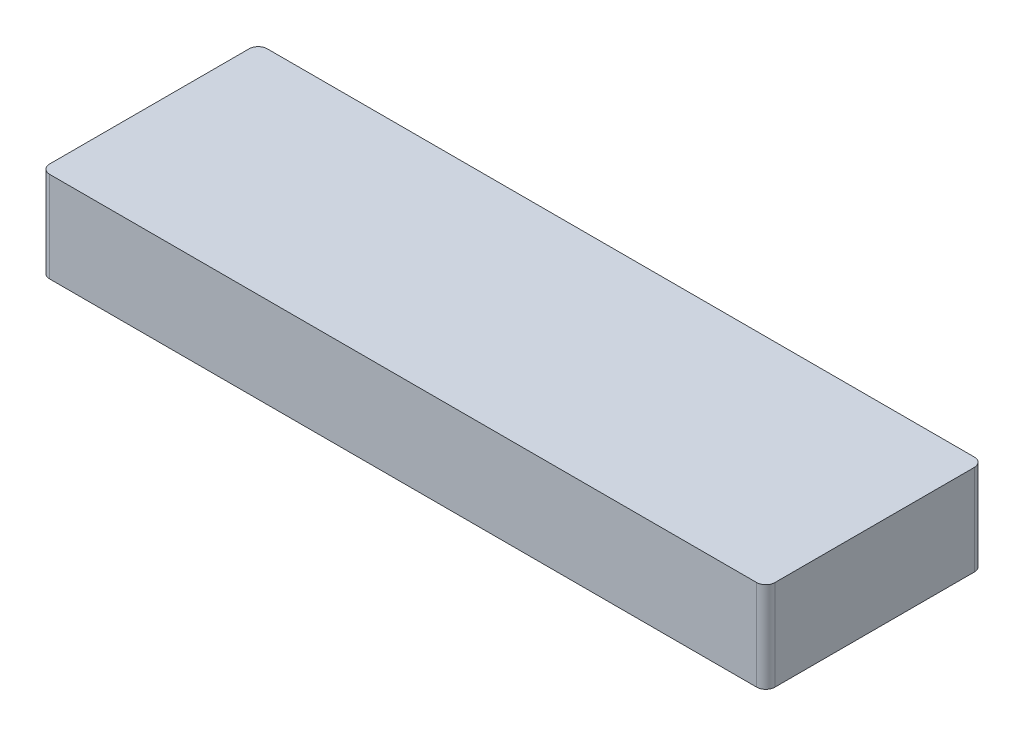
ISO-10303-21;
HEADER;
FILE_DESCRIPTION(('STEP AP214'),'2;1');
FILE_NAME('part.step','',(''),(''),'','','');
FILE_SCHEMA(('AUTOMOTIVE_DESIGN { 1 0 10303 214 1 1 1 1 }'));
ENDSEC;
DATA;
#1=APPLICATION_CONTEXT('core data for automotive mechanical design processes');
#2=APPLICATION_PROTOCOL_DEFINITION('international standard','automotive_design',2000,#1);
#3=PRODUCT_CONTEXT('',#1,'mechanical');
#4=PRODUCT('Part','Part','',(#3));
#5=PRODUCT_RELATED_PRODUCT_CATEGORY('part','',(#4));
#6=PRODUCT_DEFINITION_FORMATION('','',#4);
#7=PRODUCT_DEFINITION_CONTEXT('part definition',#1,'design');
#8=PRODUCT_DEFINITION('design','',#6,#7);
#9=PRODUCT_DEFINITION_SHAPE('','',#8);
#10=(LENGTH_UNIT() NAMED_UNIT(*) SI_UNIT(.MILLI.,.METRE.));
#11=(NAMED_UNIT(*) PLANE_ANGLE_UNIT() SI_UNIT($,.RADIAN.));
#12=(NAMED_UNIT(*) SI_UNIT($,.STERADIAN.) SOLID_ANGLE_UNIT());
#13=UNCERTAINTY_MEASURE_WITH_UNIT(LENGTH_MEASURE(1.E-05),#10,'distance_accuracy_value','');
#14=(GEOMETRIC_REPRESENTATION_CONTEXT(3) GLOBAL_UNCERTAINTY_ASSIGNED_CONTEXT((#13)) GLOBAL_UNIT_ASSIGNED_CONTEXT((#10,
#11,#12)) REPRESENTATION_CONTEXT('',''));
#15=CARTESIAN_POINT('',(0.,0.,0.));
#16=DIRECTION('',(0.,0.,1.));
#17=DIRECTION('',(1.,0.,0.));
#18=AXIS2_PLACEMENT_3D('',#15,#16,#17);
#19=CARTESIAN_POINT('',(0.,5.,0.));
#20=DIRECTION('',(1.,0.,0.));
#21=DIRECTION('',(0.,0.,-1.));
#22=AXIS2_PLACEMENT_3D('',#19,#20,#21);
#23=PLANE('',#22);
#24=DIRECTION('',(0.,0.,1.));
#25=VECTOR('',#24,1.);
#26=CARTESIAN_POINT('',(0.,5.,0.));
#27=LINE('',#26,#25);
#28=CARTESIAN_POINT('',(0.,5.,0.5));
#29=VERTEX_POINT('',#28);
#30=CARTESIAN_POINT('',(0.,5.,11.5));
#31=VERTEX_POINT('',#30);
#32=EDGE_CURVE('E121',#29,#31,#27,.T.);
#33=ORIENTED_EDGE('',*,*,#32,.F.);
#34=DIRECTION('',(0.,-1.,0.));
#35=VECTOR('',#34,1.);
#36=CARTESIAN_POINT('',(0.,5.,0.5));
#37=LINE('',#36,#35);
#38=CARTESIAN_POINT('',(0.,0.,0.5));
#39=VERTEX_POINT('',#38);
#40=EDGE_CURVE('E106',#29,#39,#37,.T.);
#41=ORIENTED_EDGE('',*,*,#40,.T.);
#42=DIRECTION('',(0.,0.,1.));
#43=VECTOR('',#42,1.);
#44=CARTESIAN_POINT('',(0.,0.,0.));
#45=LINE('',#44,#43);
#46=CARTESIAN_POINT('',(0.,0.,11.5));
#47=VERTEX_POINT('',#46);
#48=EDGE_CURVE('E118',#39,#47,#45,.T.);
#49=ORIENTED_EDGE('',*,*,#48,.T.);
#50=DIRECTION('',(0.,-1.,0.));
#51=VECTOR('',#50,1.);
#52=CARTESIAN_POINT('',(0.,5.,11.5));
#53=LINE('',#52,#51);
#54=EDGE_CURVE('E123',#47,#31,#53,.F.);
#55=ORIENTED_EDGE('',*,*,#54,.T.);
#56=EDGE_LOOP('',(#33,#41,#49,#55));
#57=FACE_BOUND('',#56,.T.);
#58=ADVANCED_FACE('F37',(#57),#23,.F.);
#59=CARTESIAN_POINT('',(0.,5.,12.));
#60=DIRECTION('',(0.,0.,-1.));
#61=DIRECTION('',(-1.,0.,0.));
#62=AXIS2_PLACEMENT_3D('',#59,#60,#61);
#63=PLANE('',#62);
#64=DIRECTION('',(1.,0.,0.));
#65=VECTOR('',#64,1.);
#66=CARTESIAN_POINT('',(0.,5.,12.));
#67=LINE('',#66,#65);
#68=CARTESIAN_POINT('',(0.500000000000001,5.,12.));
#69=VERTEX_POINT('',#68);
#70=CARTESIAN_POINT('',(39.5,5.,12.));
#71=VERTEX_POINT('',#70);
#72=EDGE_CURVE('E172',#69,#71,#67,.T.);
#73=ORIENTED_EDGE('',*,*,#72,.F.);
#74=DIRECTION('',(0.,-1.,0.));
#75=VECTOR('',#74,1.);
#76=CARTESIAN_POINT('',(0.500000000000001,5.,12.));
#77=LINE('',#76,#75);
#78=CARTESIAN_POINT('',(0.500000000000001,0.,12.));
#79=VERTEX_POINT('',#78);
#80=EDGE_CURVE('E156',#69,#79,#77,.T.);
#81=ORIENTED_EDGE('',*,*,#80,.T.);
#82=DIRECTION('',(1.,0.,0.));
#83=VECTOR('',#82,1.);
#84=CARTESIAN_POINT('',(0.,0.,12.));
#85=LINE('',#84,#83);
#86=CARTESIAN_POINT('',(39.5,0.,12.));
#87=VERTEX_POINT('',#86);
#88=EDGE_CURVE('E127',#79,#87,#85,.T.);
#89=ORIENTED_EDGE('',*,*,#88,.T.);
#90=DIRECTION('',(0.,-1.,0.));
#91=VECTOR('',#90,1.);
#92=CARTESIAN_POINT('',(39.5,5.,12.));
#93=LINE('',#92,#91);
#94=EDGE_CURVE('E154',#87,#71,#93,.F.);
#95=ORIENTED_EDGE('',*,*,#94,.T.);
#96=EDGE_LOOP('',(#73,#81,#89,#95));
#97=FACE_BOUND('',#96,.T.);
#98=ADVANCED_FACE('F182',(#97),#63,.F.);
#99=CARTESIAN_POINT('',(40.,5.,0.));
#100=DIRECTION('',(-1.,0.,0.));
#101=DIRECTION('',(0.,0.,1.));
#102=AXIS2_PLACEMENT_3D('',#99,#100,#101);
#103=PLANE('',#102);
#104=DIRECTION('',(0.,0.,-1.));
#105=VECTOR('',#104,1.);
#106=CARTESIAN_POINT('',(40.,0.,0.));
#107=LINE('',#106,#105);
#108=CARTESIAN_POINT('',(40.,0.,11.5));
#109=VERTEX_POINT('',#108);
#110=CARTESIAN_POINT('',(40.,0.,0.5));
#111=VERTEX_POINT('',#110);
#112=EDGE_CURVE('E130',#109,#111,#107,.T.);
#113=ORIENTED_EDGE('',*,*,#112,.T.);
#114=DIRECTION('',(0.,-1.,0.));
#115=VECTOR('',#114,1.);
#116=CARTESIAN_POINT('',(40.,5.,0.5));
#117=LINE('',#116,#115);
#118=CARTESIAN_POINT('',(40.,5.,0.5));
#119=VERTEX_POINT('',#118);
#120=EDGE_CURVE('E11',#111,#119,#117,.F.);
#121=ORIENTED_EDGE('',*,*,#120,.T.);
#122=DIRECTION('',(0.,0.,-1.));
#123=VECTOR('',#122,1.);
#124=CARTESIAN_POINT('',(40.,5.,0.));
#125=LINE('',#124,#123);
#126=CARTESIAN_POINT('',(40.,5.,11.5));
#127=VERTEX_POINT('',#126);
#128=EDGE_CURVE('E162',#127,#119,#125,.T.);
#129=ORIENTED_EDGE('',*,*,#128,.F.);
#130=DIRECTION('',(0.,-1.,0.));
#131=VECTOR('',#130,1.);
#132=CARTESIAN_POINT('',(40.,5.,11.5));
#133=LINE('',#132,#131);
#134=EDGE_CURVE('E45',#127,#109,#133,.T.);
#135=ORIENTED_EDGE('',*,*,#134,.T.);
#136=EDGE_LOOP('',(#113,#121,#129,#135));
#137=FACE_BOUND('',#136,.T.);
#138=ADVANCED_FACE('F161',(#137),#103,.F.);
#139=CARTESIAN_POINT('',(0.,5.,0.));
#140=DIRECTION('',(0.,0.,1.));
#141=DIRECTION('',(1.,0.,0.));
#142=AXIS2_PLACEMENT_3D('',#139,#140,#141);
#143=PLANE('',#142);
#144=DIRECTION('',(-1.,0.,0.));
#145=VECTOR('',#144,1.);
#146=CARTESIAN_POINT('',(0.,0.,0.));
#147=LINE('',#146,#145);
#148=CARTESIAN_POINT('',(39.5,0.,0.));
#149=VERTEX_POINT('',#148);
#150=CARTESIAN_POINT('',(0.5,0.,0.));
#151=VERTEX_POINT('',#150);
#152=EDGE_CURVE('E137',#149,#151,#147,.T.);
#153=ORIENTED_EDGE('',*,*,#152,.T.);
#154=DIRECTION('',(0.,-1.,0.));
#155=VECTOR('',#154,1.);
#156=CARTESIAN_POINT('',(0.5,5.,0.));
#157=LINE('',#156,#155);
#158=CARTESIAN_POINT('',(0.5,5.,0.));
#159=VERTEX_POINT('',#158);
#160=EDGE_CURVE('E107',#151,#159,#157,.F.);
#161=ORIENTED_EDGE('',*,*,#160,.T.);
#162=DIRECTION('',(-1.,0.,0.));
#163=VECTOR('',#162,1.);
#164=CARTESIAN_POINT('',(0.,5.,0.));
#165=LINE('',#164,#163);
#166=CARTESIAN_POINT('',(39.5,5.,0.));
#167=VERTEX_POINT('',#166);
#168=EDGE_CURVE('E133',#167,#159,#165,.T.);
#169=ORIENTED_EDGE('',*,*,#168,.F.);
#170=DIRECTION('',(0.,-1.,0.));
#171=VECTOR('',#170,1.);
#172=CARTESIAN_POINT('',(39.5,5.,0.));
#173=LINE('',#172,#171);
#174=EDGE_CURVE('E112',#167,#149,#173,.T.);
#175=ORIENTED_EDGE('',*,*,#174,.T.);
#176=EDGE_LOOP('',(#153,#161,#169,#175));
#177=FACE_BOUND('',#176,.T.);
#178=ADVANCED_FACE('F170',(#177),#143,.F.);
#179=CARTESIAN_POINT('',(0.,5.,0.));
#180=DIRECTION('',(0.,1.,0.));
#181=DIRECTION('',(0.,0.,1.));
#182=AXIS2_PLACEMENT_3D('',#179,#180,#181);
#183=PLANE('',#182);
#184=ORIENTED_EDGE('',*,*,#168,.T.);
#185=CARTESIAN_POINT('',(0.5,5.,0.5));
#186=DIRECTION('',(0.,1.,0.));
#187=DIRECTION('',(0.,0.,1.));
#188=AXIS2_PLACEMENT_3D('',#185,#186,#187);
#189=CIRCLE('',#188,0.5);
#190=EDGE_CURVE('E152',#159,#29,#189,.T.);
#191=ORIENTED_EDGE('',*,*,#190,.T.);
#192=ORIENTED_EDGE('',*,*,#32,.T.);
#193=CARTESIAN_POINT('',(0.500000000000001,5.,11.5));
#194=DIRECTION('',(0.,1.,0.));
#195=DIRECTION('',(0.,0.,1.));
#196=AXIS2_PLACEMENT_3D('',#193,#194,#195);
#197=CIRCLE('',#196,0.5);
#198=EDGE_CURVE('E150',#31,#69,#197,.T.);
#199=ORIENTED_EDGE('',*,*,#198,.T.);
#200=ORIENTED_EDGE('',*,*,#72,.T.);
#201=CARTESIAN_POINT('',(39.5,5.,11.5));
#202=DIRECTION('',(0.,1.,0.));
#203=DIRECTION('',(0.,0.,1.));
#204=AXIS2_PLACEMENT_3D('',#201,#202,#203);
#205=CIRCLE('',#204,0.5);
#206=EDGE_CURVE('E57',#71,#127,#205,.T.);
#207=ORIENTED_EDGE('',*,*,#206,.T.);
#208=ORIENTED_EDGE('',*,*,#128,.T.);
#209=CARTESIAN_POINT('',(39.5,5.,0.5));
#210=DIRECTION('',(0.,1.,0.));
#211=DIRECTION('',(0.,0.,1.));
#212=AXIS2_PLACEMENT_3D('',#209,#210,#211);
#213=CIRCLE('',#212,0.5);
#214=EDGE_CURVE('E148',#119,#167,#213,.T.);
#215=ORIENTED_EDGE('',*,*,#214,.T.);
#216=EDGE_LOOP('',(#184,#191,#192,#199,#200,#207,#208,#215));
#217=FACE_BOUND('',#216,.T.);
#218=ADVANCED_FACE('F176',(#217),#183,.T.);
#219=CARTESIAN_POINT('',(0.,0.,0.));
#220=DIRECTION('',(0.,1.,0.));
#221=DIRECTION('',(0.,0.,1.));
#222=AXIS2_PLACEMENT_3D('',#219,#220,#221);
#223=PLANE('',#222);
#224=ORIENTED_EDGE('',*,*,#48,.F.);
#225=CARTESIAN_POINT('',(0.5,0.,0.5));
#226=DIRECTION('',(0.,1.,0.));
#227=DIRECTION('',(0.,0.,1.));
#228=AXIS2_PLACEMENT_3D('',#225,#226,#227);
#229=CIRCLE('',#228,0.5);
#230=EDGE_CURVE('E102',#39,#151,#229,.F.);
#231=ORIENTED_EDGE('',*,*,#230,.T.);
#232=ORIENTED_EDGE('',*,*,#152,.F.);
#233=CARTESIAN_POINT('',(39.5,0.,0.5));
#234=DIRECTION('',(0.,1.,0.));
#235=DIRECTION('',(0.,0.,1.));
#236=AXIS2_PLACEMENT_3D('',#233,#234,#235);
#237=CIRCLE('',#236,0.5);
#238=EDGE_CURVE('E141',#149,#111,#237,.F.);
#239=ORIENTED_EDGE('',*,*,#238,.T.);
#240=ORIENTED_EDGE('',*,*,#112,.F.);
#241=CARTESIAN_POINT('',(39.5,0.,11.5));
#242=DIRECTION('',(0.,1.,0.));
#243=DIRECTION('',(0.,0.,1.));
#244=AXIS2_PLACEMENT_3D('',#241,#242,#243);
#245=CIRCLE('',#244,0.5);
#246=EDGE_CURVE('E122',#109,#87,#245,.F.);
#247=ORIENTED_EDGE('',*,*,#246,.T.);
#248=ORIENTED_EDGE('',*,*,#88,.F.);
#249=CARTESIAN_POINT('',(0.500000000000001,0.,11.5));
#250=DIRECTION('',(0.,1.,0.));
#251=DIRECTION('',(0.,0.,1.));
#252=AXIS2_PLACEMENT_3D('',#249,#250,#251);
#253=CIRCLE('',#252,0.5);
#254=EDGE_CURVE('E113',#79,#47,#253,.F.);
#255=ORIENTED_EDGE('',*,*,#254,.T.);
#256=EDGE_LOOP('',(#224,#231,#232,#239,#240,#247,#248,#255));
#257=FACE_BOUND('',#256,.T.);
#258=ADVANCED_FACE('F125',(#257),#223,.F.);
#259=CARTESIAN_POINT('',(0.5,5.,0.5));
#260=DIRECTION('',(0.,-1.,0.));
#261=DIRECTION('',(0.,0.,-1.));
#262=AXIS2_PLACEMENT_3D('',#259,#260,#261);
#263=CYLINDRICAL_SURFACE('',#262,0.5);
#264=ORIENTED_EDGE('',*,*,#190,.F.);
#265=ORIENTED_EDGE('',*,*,#160,.F.);
#266=ORIENTED_EDGE('',*,*,#230,.F.);
#267=ORIENTED_EDGE('',*,*,#40,.F.);
#268=EDGE_LOOP('',(#264,#265,#266,#267));
#269=FACE_BOUND('',#268,.T.);
#270=ADVANCED_FACE('F105',(#269),#263,.T.);
#271=CARTESIAN_POINT('',(0.500000000000001,5.,11.5));
#272=DIRECTION('',(0.,-1.,0.));
#273=DIRECTION('',(0.,0.,-1.));
#274=AXIS2_PLACEMENT_3D('',#271,#272,#273);
#275=CYLINDRICAL_SURFACE('',#274,0.5);
#276=ORIENTED_EDGE('',*,*,#198,.F.);
#277=ORIENTED_EDGE('',*,*,#54,.F.);
#278=ORIENTED_EDGE('',*,*,#254,.F.);
#279=ORIENTED_EDGE('',*,*,#80,.F.);
#280=EDGE_LOOP('',(#276,#277,#278,#279));
#281=FACE_BOUND('',#280,.T.);
#282=ADVANCED_FACE('F180',(#281),#275,.T.);
#283=CARTESIAN_POINT('',(39.5,5.,0.5));
#284=DIRECTION('',(0.,-1.,0.));
#285=DIRECTION('',(0.,0.,-1.));
#286=AXIS2_PLACEMENT_3D('',#283,#284,#285);
#287=CYLINDRICAL_SURFACE('',#286,0.5);
#288=ORIENTED_EDGE('',*,*,#214,.F.);
#289=ORIENTED_EDGE('',*,*,#120,.F.);
#290=ORIENTED_EDGE('',*,*,#238,.F.);
#291=ORIENTED_EDGE('',*,*,#174,.F.);
#292=EDGE_LOOP('',(#288,#289,#290,#291));
#293=FACE_BOUND('',#292,.T.);
#294=ADVANCED_FACE('F167',(#293),#287,.T.);
#295=CARTESIAN_POINT('',(39.5,5.,11.5));
#296=DIRECTION('',(0.,-1.,0.));
#297=DIRECTION('',(0.,0.,-1.));
#298=AXIS2_PLACEMENT_3D('',#295,#296,#297);
#299=CYLINDRICAL_SURFACE('',#298,0.5);
#300=ORIENTED_EDGE('',*,*,#206,.F.);
#301=ORIENTED_EDGE('',*,*,#94,.F.);
#302=ORIENTED_EDGE('',*,*,#246,.F.);
#303=ORIENTED_EDGE('',*,*,#134,.F.);
#304=EDGE_LOOP('',(#300,#301,#302,#303));
#305=FACE_BOUND('',#304,.T.);
#306=ADVANCED_FACE('F39',(#305),#299,.T.);
#307=CLOSED_SHELL('',(#58,#98,#138,#178,#218,#258,#270,#282,#294,#306));
#308=MANIFOLD_SOLID_BREP('B2',#307);
#309=ADVANCED_BREP_SHAPE_REPRESENTATION('',(#18,#308),#14);
#310=SHAPE_DEFINITION_REPRESENTATION(#9,#309);
ENDSEC;
END-ISO-10303-21;
